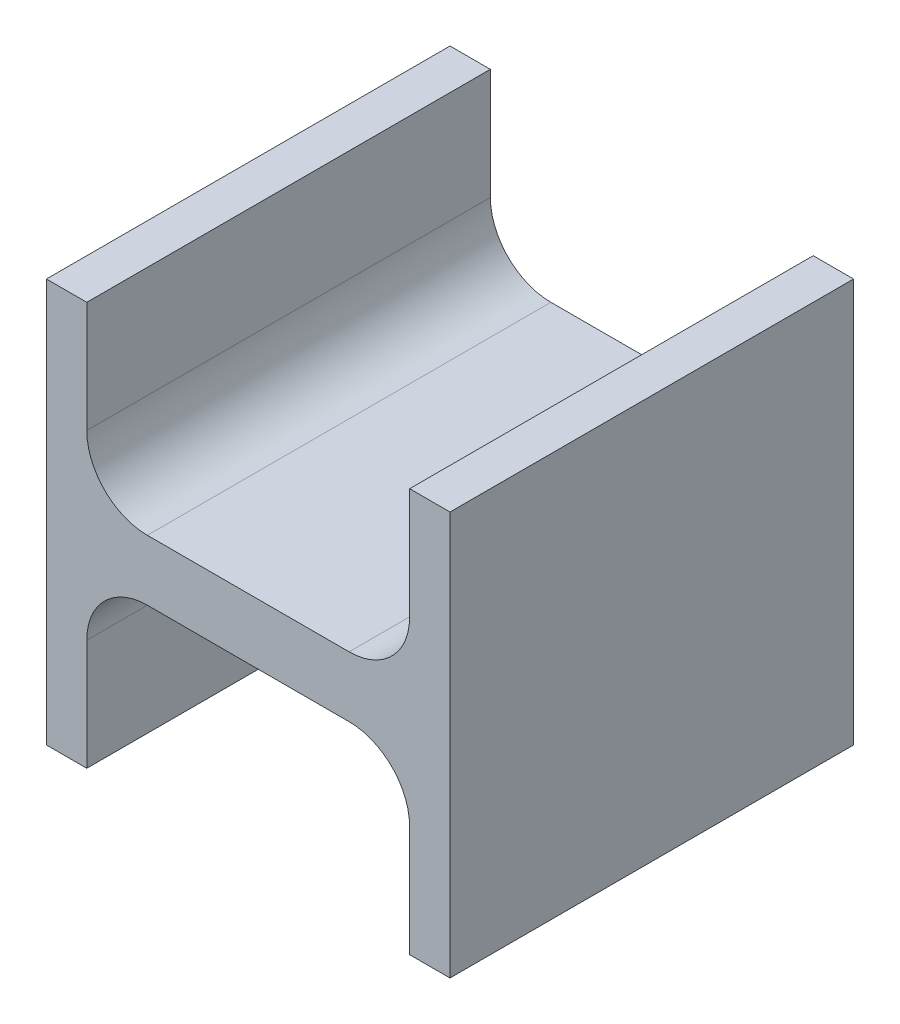
ISO-10303-21;
HEADER;
FILE_DESCRIPTION(('STEP AP214'),'2;1');
FILE_NAME('part.step','',(''),(''),'','','');
FILE_SCHEMA(('AUTOMOTIVE_DESIGN { 1 0 10303 214 1 1 1 1 }'));
ENDSEC;
DATA;
#1=APPLICATION_CONTEXT('core data for automotive mechanical design processes');
#2=APPLICATION_PROTOCOL_DEFINITION('international standard','automotive_design',2000,#1);
#3=PRODUCT_CONTEXT('',#1,'mechanical');
#4=PRODUCT('Part','Part','',(#3));
#5=PRODUCT_RELATED_PRODUCT_CATEGORY('part','',(#4));
#6=PRODUCT_DEFINITION_FORMATION('','',#4);
#7=PRODUCT_DEFINITION_CONTEXT('part definition',#1,'design');
#8=PRODUCT_DEFINITION('design','',#6,#7);
#9=PRODUCT_DEFINITION_SHAPE('','',#8);
#10=(LENGTH_UNIT() NAMED_UNIT(*) SI_UNIT(.MILLI.,.METRE.));
#11=(NAMED_UNIT(*) PLANE_ANGLE_UNIT() SI_UNIT($,.RADIAN.));
#12=(NAMED_UNIT(*) SI_UNIT($,.STERADIAN.) SOLID_ANGLE_UNIT());
#13=UNCERTAINTY_MEASURE_WITH_UNIT(LENGTH_MEASURE(1.E-05),#10,'distance_accuracy_value','');
#14=(GEOMETRIC_REPRESENTATION_CONTEXT(3) GLOBAL_UNCERTAINTY_ASSIGNED_CONTEXT((#13)) GLOBAL_UNIT_ASSIGNED_CONTEXT((#10,
#11,#12)) REPRESENTATION_CONTEXT('',''));
#15=CARTESIAN_POINT('',(0.,0.,0.));
#16=DIRECTION('',(0.,0.,1.));
#17=DIRECTION('',(1.,0.,0.));
#18=AXIS2_PLACEMENT_3D('',#15,#16,#17);
#19=CARTESIAN_POINT('',(-10.,10.,20.));
#20=DIRECTION('',(1.,0.,0.));
#21=DIRECTION('',(0.,1.,0.));
#22=AXIS2_PLACEMENT_3D('',#19,#20,#21);
#23=PLANE('',#22);
#24=DIRECTION('',(0.,-1.,0.));
#25=VECTOR('',#24,1.);
#26=CARTESIAN_POINT('',(-10.,10.,0.));
#27=LINE('',#26,#25);
#28=CARTESIAN_POINT('',(-10.,10.,0.));
#29=VERTEX_POINT('',#28);
#30=CARTESIAN_POINT('',(-10.,-10.,0.));
#31=VERTEX_POINT('',#30);
#32=EDGE_CURVE('E182',#29,#31,#27,.T.);
#33=ORIENTED_EDGE('',*,*,#32,.T.);
#34=DIRECTION('',(0.,0.,-1.));
#35=VECTOR('',#34,1.);
#36=CARTESIAN_POINT('',(-10.,-10.,20.));
#37=LINE('',#36,#35);
#38=CARTESIAN_POINT('',(-10.,-10.,20.));
#39=VERTEX_POINT('',#38);
#40=EDGE_CURVE('E162',#39,#31,#37,.T.);
#41=ORIENTED_EDGE('',*,*,#40,.F.);
#42=DIRECTION('',(0.,-1.,0.));
#43=VECTOR('',#42,1.);
#44=CARTESIAN_POINT('',(-10.,10.,20.));
#45=LINE('',#44,#43);
#46=CARTESIAN_POINT('',(-10.,10.,20.));
#47=VERTEX_POINT('',#46);
#48=EDGE_CURVE('E170',#47,#39,#45,.T.);
#49=ORIENTED_EDGE('',*,*,#48,.F.);
#50=DIRECTION('',(0.,0.,-1.));
#51=VECTOR('',#50,1.);
#52=CARTESIAN_POINT('',(-10.,10.,20.));
#53=LINE('',#52,#51);
#54=EDGE_CURVE('E267',#47,#29,#53,.T.);
#55=ORIENTED_EDGE('',*,*,#54,.T.);
#56=EDGE_LOOP('',(#33,#41,#49,#55));
#57=FACE_BOUND('',#56,.T.);
#58=ADVANCED_FACE('F45',(#57),#23,.F.);
#59=CARTESIAN_POINT('',(-10.,-10.,20.));
#60=DIRECTION('',(0.,1.,0.));
#61=DIRECTION('',(0.,0.,1.));
#62=AXIS2_PLACEMENT_3D('',#59,#60,#61);
#63=PLANE('',#62);
#64=DIRECTION('',(1.,0.,0.));
#65=VECTOR('',#64,1.);
#66=CARTESIAN_POINT('',(-10.,-10.,0.));
#67=LINE('',#66,#65);
#68=CARTESIAN_POINT('',(-8.,-10.,0.));
#69=VERTEX_POINT('',#68);
#70=EDGE_CURVE('E251',#31,#69,#67,.T.);
#71=ORIENTED_EDGE('',*,*,#70,.T.);
#72=DIRECTION('',(0.,0.,-1.));
#73=VECTOR('',#72,1.);
#74=CARTESIAN_POINT('',(-8.,-10.,20.));
#75=LINE('',#74,#73);
#76=CARTESIAN_POINT('',(-8.,-10.,20.));
#77=VERTEX_POINT('',#76);
#78=EDGE_CURVE('E165',#77,#69,#75,.T.);
#79=ORIENTED_EDGE('',*,*,#78,.F.);
#80=DIRECTION('',(1.,0.,0.));
#81=VECTOR('',#80,1.);
#82=CARTESIAN_POINT('',(-10.,-10.,20.));
#83=LINE('',#82,#81);
#84=EDGE_CURVE('E158',#39,#77,#83,.T.);
#85=ORIENTED_EDGE('',*,*,#84,.F.);
#86=ORIENTED_EDGE('',*,*,#40,.T.);
#87=EDGE_LOOP('',(#71,#79,#85,#86));
#88=FACE_BOUND('',#87,.T.);
#89=ADVANCED_FACE('F160',(#88),#63,.F.);
#90=CARTESIAN_POINT('',(-8.,-10.,20.));
#91=DIRECTION('',(-1.,0.,0.));
#92=DIRECTION('',(0.,0.,1.));
#93=AXIS2_PLACEMENT_3D('',#90,#91,#92);
#94=PLANE('',#93);
#95=DIRECTION('',(0.,1.,0.));
#96=VECTOR('',#95,1.);
#97=CARTESIAN_POINT('',(-8.,-10.,0.));
#98=LINE('',#97,#96);
#99=CARTESIAN_POINT('',(-8.,-4.5,0.));
#100=VERTEX_POINT('',#99);
#101=EDGE_CURVE('E246',#69,#100,#98,.T.);
#102=ORIENTED_EDGE('',*,*,#101,.T.);
#103=DIRECTION('',(0.,0.,-1.));
#104=VECTOR('',#103,1.);
#105=CARTESIAN_POINT('',(-8.,-4.5,20.));
#106=LINE('',#105,#104);
#107=CARTESIAN_POINT('',(-8.,-4.5,20.));
#108=VERTEX_POINT('',#107);
#109=EDGE_CURVE('E203',#100,#108,#106,.F.);
#110=ORIENTED_EDGE('',*,*,#109,.T.);
#111=DIRECTION('',(0.,1.,0.));
#112=VECTOR('',#111,1.);
#113=CARTESIAN_POINT('',(-8.,-10.,20.));
#114=LINE('',#113,#112);
#115=EDGE_CURVE('E169',#77,#108,#114,.T.);
#116=ORIENTED_EDGE('',*,*,#115,.F.);
#117=ORIENTED_EDGE('',*,*,#78,.T.);
#118=EDGE_LOOP('',(#102,#110,#116,#117));
#119=FACE_BOUND('',#118,.T.);
#120=ADVANCED_FACE('F310',(#119),#94,.F.);
#121=CARTESIAN_POINT('',(-8.,-1.5,20.));
#122=DIRECTION('',(0.,1.,0.));
#123=DIRECTION('',(0.,0.,1.));
#124=AXIS2_PLACEMENT_3D('',#121,#122,#123);
#125=PLANE('',#124);
#126=DIRECTION('',(1.,0.,0.));
#127=VECTOR('',#126,1.);
#128=CARTESIAN_POINT('',(-8.,-1.5,20.));
#129=LINE('',#128,#127);
#130=CARTESIAN_POINT('',(-5.,-1.5,20.));
#131=VERTEX_POINT('',#130);
#132=CARTESIAN_POINT('',(5.,-1.5,20.));
#133=VERTEX_POINT('',#132);
#134=EDGE_CURVE('E225',#131,#133,#129,.T.);
#135=ORIENTED_EDGE('',*,*,#134,.F.);
#136=DIRECTION('',(0.,0.,-1.));
#137=VECTOR('',#136,1.);
#138=CARTESIAN_POINT('',(-5.,-1.5,0.));
#139=LINE('',#138,#137);
#140=CARTESIAN_POINT('',(-5.,-1.5,0.));
#141=VERTEX_POINT('',#140);
#142=EDGE_CURVE('E200',#131,#141,#139,.T.);
#143=ORIENTED_EDGE('',*,*,#142,.T.);
#144=DIRECTION('',(1.,0.,0.));
#145=VECTOR('',#144,1.);
#146=CARTESIAN_POINT('',(-8.,-1.5,0.));
#147=LINE('',#146,#145);
#148=CARTESIAN_POINT('',(5.,-1.5,0.));
#149=VERTEX_POINT('',#148);
#150=EDGE_CURVE('E240',#141,#149,#147,.T.);
#151=ORIENTED_EDGE('',*,*,#150,.T.);
#152=DIRECTION('',(0.,0.,-1.));
#153=VECTOR('',#152,1.);
#154=CARTESIAN_POINT('',(5.,-1.5,20.));
#155=LINE('',#154,#153);
#156=EDGE_CURVE('E198',#149,#133,#155,.F.);
#157=ORIENTED_EDGE('',*,*,#156,.T.);
#158=EDGE_LOOP('',(#135,#143,#151,#157));
#159=FACE_BOUND('',#158,.T.);
#160=ADVANCED_FACE('F244',(#159),#125,.F.);
#161=CARTESIAN_POINT('',(8.,-1.5,20.));
#162=DIRECTION('',(1.,0.,0.));
#163=DIRECTION('',(0.,0.,-1.));
#164=AXIS2_PLACEMENT_3D('',#161,#162,#163);
#165=PLANE('',#164);
#166=DIRECTION('',(0.,-1.,0.));
#167=VECTOR('',#166,1.);
#168=CARTESIAN_POINT('',(8.,-1.5,20.));
#169=LINE('',#168,#167);
#170=CARTESIAN_POINT('',(8.,-4.5,20.));
#171=VERTEX_POINT('',#170);
#172=CARTESIAN_POINT('',(8.,-10.,20.));
#173=VERTEX_POINT('',#172);
#174=EDGE_CURVE('E222',#171,#173,#169,.T.);
#175=ORIENTED_EDGE('',*,*,#174,.F.);
#176=DIRECTION('',(0.,0.,-1.));
#177=VECTOR('',#176,1.);
#178=CARTESIAN_POINT('',(8.,-4.5,0.));
#179=LINE('',#178,#177);
#180=CARTESIAN_POINT('',(8.,-4.5,0.));
#181=VERTEX_POINT('',#180);
#182=EDGE_CURVE('E205',#171,#181,#179,.T.);
#183=ORIENTED_EDGE('',*,*,#182,.T.);
#184=DIRECTION('',(0.,-1.,0.));
#185=VECTOR('',#184,1.);
#186=CARTESIAN_POINT('',(8.,-1.5,0.));
#187=LINE('',#186,#185);
#188=CARTESIAN_POINT('',(8.,-10.,0.));
#189=VERTEX_POINT('',#188);
#190=EDGE_CURVE('E242',#181,#189,#187,.T.);
#191=ORIENTED_EDGE('',*,*,#190,.T.);
#192=DIRECTION('',(0.,0.,-1.));
#193=VECTOR('',#192,1.);
#194=CARTESIAN_POINT('',(8.,-10.,20.));
#195=LINE('',#194,#193);
#196=EDGE_CURVE('E188',#173,#189,#195,.T.);
#197=ORIENTED_EDGE('',*,*,#196,.F.);
#198=EDGE_LOOP('',(#175,#183,#191,#197));
#199=FACE_BOUND('',#198,.T.);
#200=ADVANCED_FACE('F230',(#199),#165,.F.);
#201=CARTESIAN_POINT('',(8.,-10.,20.));
#202=DIRECTION('',(0.,1.,0.));
#203=DIRECTION('',(0.,0.,1.));
#204=AXIS2_PLACEMENT_3D('',#201,#202,#203);
#205=PLANE('',#204);
#206=DIRECTION('',(1.,0.,0.));
#207=VECTOR('',#206,1.);
#208=CARTESIAN_POINT('',(8.,-10.,0.));
#209=LINE('',#208,#207);
#210=CARTESIAN_POINT('',(10.,-10.,0.));
#211=VERTEX_POINT('',#210);
#212=EDGE_CURVE('E248',#189,#211,#209,.T.);
#213=ORIENTED_EDGE('',*,*,#212,.T.);
#214=DIRECTION('',(0.,0.,-1.));
#215=VECTOR('',#214,1.);
#216=CARTESIAN_POINT('',(10.,-10.,20.));
#217=LINE('',#216,#215);
#218=CARTESIAN_POINT('',(10.,-10.,20.));
#219=VERTEX_POINT('',#218);
#220=EDGE_CURVE('E278',#219,#211,#217,.T.);
#221=ORIENTED_EDGE('',*,*,#220,.F.);
#222=DIRECTION('',(1.,0.,0.));
#223=VECTOR('',#222,1.);
#224=CARTESIAN_POINT('',(8.,-10.,20.));
#225=LINE('',#224,#223);
#226=EDGE_CURVE('E234',#173,#219,#225,.T.);
#227=ORIENTED_EDGE('',*,*,#226,.F.);
#228=ORIENTED_EDGE('',*,*,#196,.T.);
#229=EDGE_LOOP('',(#213,#221,#227,#228));
#230=FACE_BOUND('',#229,.T.);
#231=ADVANCED_FACE('F283',(#230),#205,.F.);
#232=CARTESIAN_POINT('',(10.,10.,20.));
#233=DIRECTION('',(-1.,0.,0.));
#234=DIRECTION('',(0.,-1.,0.));
#235=AXIS2_PLACEMENT_3D('',#232,#233,#234);
#236=PLANE('',#235);
#237=DIRECTION('',(0.,1.,0.));
#238=VECTOR('',#237,1.);
#239=CARTESIAN_POINT('',(10.,10.,0.));
#240=LINE('',#239,#238);
#241=CARTESIAN_POINT('',(10.,10.,0.));
#242=VERTEX_POINT('',#241);
#243=EDGE_CURVE('E256',#211,#242,#240,.T.);
#244=ORIENTED_EDGE('',*,*,#243,.T.);
#245=DIRECTION('',(0.,0.,-1.));
#246=VECTOR('',#245,1.);
#247=CARTESIAN_POINT('',(10.,10.,20.));
#248=LINE('',#247,#246);
#249=CARTESIAN_POINT('',(10.,10.,20.));
#250=VERTEX_POINT('',#249);
#251=EDGE_CURVE('E275',#250,#242,#248,.T.);
#252=ORIENTED_EDGE('',*,*,#251,.F.);
#253=DIRECTION('',(0.,1.,0.));
#254=VECTOR('',#253,1.);
#255=CARTESIAN_POINT('',(10.,10.,20.));
#256=LINE('',#255,#254);
#257=EDGE_CURVE('E297',#219,#250,#256,.T.);
#258=ORIENTED_EDGE('',*,*,#257,.F.);
#259=ORIENTED_EDGE('',*,*,#220,.T.);
#260=EDGE_LOOP('',(#244,#252,#258,#259));
#261=FACE_BOUND('',#260,.T.);
#262=ADVANCED_FACE('F289',(#261),#236,.F.);
#263=CARTESIAN_POINT('',(8.,10.,20.));
#264=DIRECTION('',(0.,-1.,0.));
#265=DIRECTION('',(0.,0.,-1.));
#266=AXIS2_PLACEMENT_3D('',#263,#264,#265);
#267=PLANE('',#266);
#268=DIRECTION('',(-1.,0.,0.));
#269=VECTOR('',#268,1.);
#270=CARTESIAN_POINT('',(8.,10.,0.));
#271=LINE('',#270,#269);
#272=CARTESIAN_POINT('',(8.,10.,0.));
#273=VERTEX_POINT('',#272);
#274=EDGE_CURVE('E258',#242,#273,#271,.T.);
#275=ORIENTED_EDGE('',*,*,#274,.T.);
#276=DIRECTION('',(0.,0.,-1.));
#277=VECTOR('',#276,1.);
#278=CARTESIAN_POINT('',(8.,10.,20.));
#279=LINE('',#278,#277);
#280=CARTESIAN_POINT('',(8.,10.,20.));
#281=VERTEX_POINT('',#280);
#282=EDGE_CURVE('E272',#281,#273,#279,.T.);
#283=ORIENTED_EDGE('',*,*,#282,.F.);
#284=DIRECTION('',(-1.,0.,0.));
#285=VECTOR('',#284,1.);
#286=CARTESIAN_POINT('',(8.,10.,20.));
#287=LINE('',#286,#285);
#288=EDGE_CURVE('E295',#250,#281,#287,.T.);
#289=ORIENTED_EDGE('',*,*,#288,.F.);
#290=ORIENTED_EDGE('',*,*,#251,.T.);
#291=EDGE_LOOP('',(#275,#283,#289,#290));
#292=FACE_BOUND('',#291,.T.);
#293=ADVANCED_FACE('F293',(#292),#267,.F.);
#294=CARTESIAN_POINT('',(8.,1.5,20.));
#295=DIRECTION('',(1.,0.,0.));
#296=DIRECTION('',(0.,0.,-1.));
#297=AXIS2_PLACEMENT_3D('',#294,#295,#296);
#298=PLANE('',#297);
#299=DIRECTION('',(0.,-1.,0.));
#300=VECTOR('',#299,1.);
#301=CARTESIAN_POINT('',(8.,1.5,0.));
#302=LINE('',#301,#300);
#303=CARTESIAN_POINT('',(8.,4.5,0.));
#304=VERTEX_POINT('',#303);
#305=EDGE_CURVE('E260',#273,#304,#302,.T.);
#306=ORIENTED_EDGE('',*,*,#305,.T.);
#307=DIRECTION('',(0.,0.,-1.));
#308=VECTOR('',#307,1.);
#309=CARTESIAN_POINT('',(8.,4.5,20.));
#310=LINE('',#309,#308);
#311=CARTESIAN_POINT('',(8.,4.5,20.));
#312=VERTEX_POINT('',#311);
#313=EDGE_CURVE('E60',#304,#312,#310,.F.);
#314=ORIENTED_EDGE('',*,*,#313,.T.);
#315=DIRECTION('',(0.,-1.,0.));
#316=VECTOR('',#315,1.);
#317=CARTESIAN_POINT('',(8.,1.5,20.));
#318=LINE('',#317,#316);
#319=EDGE_CURVE('E296',#281,#312,#318,.T.);
#320=ORIENTED_EDGE('',*,*,#319,.F.);
#321=ORIENTED_EDGE('',*,*,#282,.T.);
#322=EDGE_LOOP('',(#306,#314,#320,#321));
#323=FACE_BOUND('',#322,.T.);
#324=ADVANCED_FACE('F345',(#323),#298,.F.);
#325=CARTESIAN_POINT('',(-8.,1.5,20.));
#326=DIRECTION('',(0.,-1.,0.));
#327=DIRECTION('',(0.,0.,-1.));
#328=AXIS2_PLACEMENT_3D('',#325,#326,#327);
#329=PLANE('',#328);
#330=DIRECTION('',(-1.,0.,0.));
#331=VECTOR('',#330,1.);
#332=CARTESIAN_POINT('',(-8.,1.5,20.));
#333=LINE('',#332,#331);
#334=CARTESIAN_POINT('',(5.,1.5,20.));
#335=VERTEX_POINT('',#334);
#336=CARTESIAN_POINT('',(-5.,1.5,20.));
#337=VERTEX_POINT('',#336);
#338=EDGE_CURVE('E299',#335,#337,#333,.T.);
#339=ORIENTED_EDGE('',*,*,#338,.F.);
#340=DIRECTION('',(0.,0.,-1.));
#341=VECTOR('',#340,1.);
#342=CARTESIAN_POINT('',(5.,1.5,0.));
#343=LINE('',#342,#341);
#344=CARTESIAN_POINT('',(5.,1.5,0.));
#345=VERTEX_POINT('',#344);
#346=EDGE_CURVE('E208',#335,#345,#343,.T.);
#347=ORIENTED_EDGE('',*,*,#346,.T.);
#348=DIRECTION('',(-1.,0.,0.));
#349=VECTOR('',#348,1.);
#350=CARTESIAN_POINT('',(-8.,1.5,0.));
#351=LINE('',#350,#349);
#352=CARTESIAN_POINT('',(-5.,1.5,0.));
#353=VERTEX_POINT('',#352);
#354=EDGE_CURVE('E262',#345,#353,#351,.T.);
#355=ORIENTED_EDGE('',*,*,#354,.T.);
#356=DIRECTION('',(0.,0.,-1.));
#357=VECTOR('',#356,1.);
#358=CARTESIAN_POINT('',(-5.,1.5,20.));
#359=LINE('',#358,#357);
#360=EDGE_CURVE('E186',#353,#337,#359,.F.);
#361=ORIENTED_EDGE('',*,*,#360,.T.);
#362=EDGE_LOOP('',(#339,#347,#355,#361));
#363=FACE_BOUND('',#362,.T.);
#364=ADVANCED_FACE('F348',(#363),#329,.F.);
#365=CARTESIAN_POINT('',(-8.,10.,20.));
#366=DIRECTION('',(-1.,0.,0.));
#367=DIRECTION('',(0.,0.,1.));
#368=AXIS2_PLACEMENT_3D('',#365,#366,#367);
#369=PLANE('',#368);
#370=DIRECTION('',(0.,1.,0.));
#371=VECTOR('',#370,1.);
#372=CARTESIAN_POINT('',(-8.,10.,20.));
#373=LINE('',#372,#371);
#374=CARTESIAN_POINT('',(-8.,4.5,20.));
#375=VERTEX_POINT('',#374);
#376=CARTESIAN_POINT('',(-8.,10.,20.));
#377=VERTEX_POINT('',#376);
#378=EDGE_CURVE('E305',#375,#377,#373,.T.);
#379=ORIENTED_EDGE('',*,*,#378,.F.);
#380=DIRECTION('',(0.,0.,-1.));
#381=VECTOR('',#380,1.);
#382=CARTESIAN_POINT('',(-8.,4.5,0.));
#383=LINE('',#382,#381);
#384=CARTESIAN_POINT('',(-8.,4.5,0.));
#385=VERTEX_POINT('',#384);
#386=EDGE_CURVE('E183',#375,#385,#383,.T.);
#387=ORIENTED_EDGE('',*,*,#386,.T.);
#388=DIRECTION('',(0.,1.,0.));
#389=VECTOR('',#388,1.);
#390=CARTESIAN_POINT('',(-8.,10.,0.));
#391=LINE('',#390,#389);
#392=CARTESIAN_POINT('',(-8.,10.,0.));
#393=VERTEX_POINT('',#392);
#394=EDGE_CURVE('E264',#385,#393,#391,.T.);
#395=ORIENTED_EDGE('',*,*,#394,.T.);
#396=DIRECTION('',(0.,0.,-1.));
#397=VECTOR('',#396,1.);
#398=CARTESIAN_POINT('',(-8.,10.,20.));
#399=LINE('',#398,#397);
#400=EDGE_CURVE('E269',#377,#393,#399,.T.);
#401=ORIENTED_EDGE('',*,*,#400,.F.);
#402=EDGE_LOOP('',(#379,#387,#395,#401));
#403=FACE_BOUND('',#402,.T.);
#404=ADVANCED_FACE('F351',(#403),#369,.F.);
#405=CARTESIAN_POINT('',(-10.,10.,20.));
#406=DIRECTION('',(0.,-1.,0.));
#407=DIRECTION('',(0.,0.,-1.));
#408=AXIS2_PLACEMENT_3D('',#405,#406,#407);
#409=PLANE('',#408);
#410=DIRECTION('',(-1.,0.,0.));
#411=VECTOR('',#410,1.);
#412=CARTESIAN_POINT('',(-10.,10.,0.));
#413=LINE('',#412,#411);
#414=EDGE_CURVE('E179',#393,#29,#413,.T.);
#415=ORIENTED_EDGE('',*,*,#414,.T.);
#416=ORIENTED_EDGE('',*,*,#54,.F.);
#417=DIRECTION('',(-1.,0.,0.));
#418=VECTOR('',#417,1.);
#419=CARTESIAN_POINT('',(-10.,10.,20.));
#420=LINE('',#419,#418);
#421=EDGE_CURVE('E175',#377,#47,#420,.T.);
#422=ORIENTED_EDGE('',*,*,#421,.F.);
#423=ORIENTED_EDGE('',*,*,#400,.T.);
#424=EDGE_LOOP('',(#415,#416,#422,#423));
#425=FACE_BOUND('',#424,.T.);
#426=ADVANCED_FACE('F355',(#425),#409,.F.);
#427=CARTESIAN_POINT('',(0.,0.,20.));
#428=DIRECTION('',(0.,0.,1.));
#429=DIRECTION('',(1.,0.,0.));
#430=AXIS2_PLACEMENT_3D('',#427,#428,#429);
#431=PLANE('',#430);
#432=ORIENTED_EDGE('',*,*,#48,.T.);
#433=ORIENTED_EDGE('',*,*,#84,.T.);
#434=ORIENTED_EDGE('',*,*,#115,.T.);
#435=CARTESIAN_POINT('',(-5.,-4.5,20.));
#436=DIRECTION('',(0.,0.,1.));
#437=DIRECTION('',(1.,0.,0.));
#438=AXIS2_PLACEMENT_3D('',#435,#436,#437);
#439=CIRCLE('',#438,3.);
#440=EDGE_CURVE('E214',#108,#131,#439,.F.);
#441=ORIENTED_EDGE('',*,*,#440,.T.);
#442=ORIENTED_EDGE('',*,*,#134,.T.);
#443=CARTESIAN_POINT('',(5.,-4.5,20.));
#444=DIRECTION('',(0.,0.,1.));
#445=DIRECTION('',(1.,0.,0.));
#446=AXIS2_PLACEMENT_3D('',#443,#444,#445);
#447=CIRCLE('',#446,3.);
#448=EDGE_CURVE('E218',#133,#171,#447,.F.);
#449=ORIENTED_EDGE('',*,*,#448,.T.);
#450=ORIENTED_EDGE('',*,*,#174,.T.);
#451=ORIENTED_EDGE('',*,*,#226,.T.);
#452=ORIENTED_EDGE('',*,*,#257,.T.);
#453=ORIENTED_EDGE('',*,*,#288,.T.);
#454=ORIENTED_EDGE('',*,*,#319,.T.);
#455=CARTESIAN_POINT('',(5.,4.5,20.));
#456=DIRECTION('',(0.,0.,1.));
#457=DIRECTION('',(1.,0.,0.));
#458=AXIS2_PLACEMENT_3D('',#455,#456,#457);
#459=CIRCLE('',#458,3.);
#460=EDGE_CURVE('E12',#312,#335,#459,.F.);
#461=ORIENTED_EDGE('',*,*,#460,.T.);
#462=ORIENTED_EDGE('',*,*,#338,.T.);
#463=CARTESIAN_POINT('',(-5.,4.5,20.));
#464=DIRECTION('',(0.,0.,1.));
#465=DIRECTION('',(1.,0.,0.));
#466=AXIS2_PLACEMENT_3D('',#463,#464,#465);
#467=CIRCLE('',#466,3.);
#468=EDGE_CURVE('E196',#337,#375,#467,.F.);
#469=ORIENTED_EDGE('',*,*,#468,.T.);
#470=ORIENTED_EDGE('',*,*,#378,.T.);
#471=ORIENTED_EDGE('',*,*,#421,.T.);
#472=EDGE_LOOP('',(#432,#433,#434,#441,#442,#449,#450,#451,#452,#453,#454,#461,#462,#469,#470,#471));
#473=FACE_BOUND('',#472,.T.);
#474=ADVANCED_FACE('F173',(#473),#431,.T.);
#475=CARTESIAN_POINT('',(0.,0.,0.));
#476=DIRECTION('',(0.,0.,1.));
#477=DIRECTION('',(1.,0.,0.));
#478=AXIS2_PLACEMENT_3D('',#475,#476,#477);
#479=PLANE('',#478);
#480=ORIENTED_EDGE('',*,*,#32,.F.);
#481=ORIENTED_EDGE('',*,*,#414,.F.);
#482=ORIENTED_EDGE('',*,*,#394,.F.);
#483=CARTESIAN_POINT('',(-5.,4.5,0.));
#484=DIRECTION('',(0.,0.,1.));
#485=DIRECTION('',(1.,0.,0.));
#486=AXIS2_PLACEMENT_3D('',#483,#484,#485);
#487=CIRCLE('',#486,3.);
#488=EDGE_CURVE('E193',#385,#353,#487,.T.);
#489=ORIENTED_EDGE('',*,*,#488,.T.);
#490=ORIENTED_EDGE('',*,*,#354,.F.);
#491=CARTESIAN_POINT('',(5.,4.5,0.));
#492=DIRECTION('',(0.,0.,1.));
#493=DIRECTION('',(1.,0.,0.));
#494=AXIS2_PLACEMENT_3D('',#491,#492,#493);
#495=CIRCLE('',#494,3.);
#496=EDGE_CURVE('E53',#345,#304,#495,.T.);
#497=ORIENTED_EDGE('',*,*,#496,.T.);
#498=ORIENTED_EDGE('',*,*,#305,.F.);
#499=ORIENTED_EDGE('',*,*,#274,.F.);
#500=ORIENTED_EDGE('',*,*,#243,.F.);
#501=ORIENTED_EDGE('',*,*,#212,.F.);
#502=ORIENTED_EDGE('',*,*,#190,.F.);
#503=CARTESIAN_POINT('',(5.,-4.5,0.));
#504=DIRECTION('',(0.,0.,1.));
#505=DIRECTION('',(1.,0.,0.));
#506=AXIS2_PLACEMENT_3D('',#503,#504,#505);
#507=CIRCLE('',#506,3.);
#508=EDGE_CURVE('E216',#181,#149,#507,.T.);
#509=ORIENTED_EDGE('',*,*,#508,.T.);
#510=ORIENTED_EDGE('',*,*,#150,.F.);
#511=CARTESIAN_POINT('',(-5.,-4.5,0.));
#512=DIRECTION('',(0.,0.,1.));
#513=DIRECTION('',(1.,0.,0.));
#514=AXIS2_PLACEMENT_3D('',#511,#512,#513);
#515=CIRCLE('',#514,3.);
#516=EDGE_CURVE('E212',#141,#100,#515,.T.);
#517=ORIENTED_EDGE('',*,*,#516,.T.);
#518=ORIENTED_EDGE('',*,*,#101,.F.);
#519=ORIENTED_EDGE('',*,*,#70,.F.);
#520=EDGE_LOOP('',(#480,#481,#482,#489,#490,#497,#498,#499,#500,#501,#502,#509,#510,#517,#518,#519));
#521=FACE_BOUND('',#520,.T.);
#522=ADVANCED_FACE('F239',(#521),#479,.F.);
#523=CARTESIAN_POINT('',(-5.,4.5,20.));
#524=DIRECTION('',(0.,0.,1.));
#525=DIRECTION('',(1.,0.,0.));
#526=AXIS2_PLACEMENT_3D('',#523,#524,#525);
#527=CYLINDRICAL_SURFACE('',#526,3.);
#528=ORIENTED_EDGE('',*,*,#468,.F.);
#529=ORIENTED_EDGE('',*,*,#360,.F.);
#530=ORIENTED_EDGE('',*,*,#488,.F.);
#531=ORIENTED_EDGE('',*,*,#386,.F.);
#532=EDGE_LOOP('',(#528,#529,#530,#531));
#533=FACE_BOUND('',#532,.T.);
#534=ADVANCED_FACE('F318',(#533),#527,.F.);
#535=CARTESIAN_POINT('',(-5.,-4.5,20.));
#536=DIRECTION('',(0.,0.,1.));
#537=DIRECTION('',(1.,0.,0.));
#538=AXIS2_PLACEMENT_3D('',#535,#536,#537);
#539=CYLINDRICAL_SURFACE('',#538,3.);
#540=ORIENTED_EDGE('',*,*,#440,.F.);
#541=ORIENTED_EDGE('',*,*,#109,.F.);
#542=ORIENTED_EDGE('',*,*,#516,.F.);
#543=ORIENTED_EDGE('',*,*,#142,.F.);
#544=EDGE_LOOP('',(#540,#541,#542,#543));
#545=FACE_BOUND('',#544,.T.);
#546=ADVANCED_FACE('F314',(#545),#539,.F.);
#547=CARTESIAN_POINT('',(5.,-4.5,20.));
#548=DIRECTION('',(0.,0.,1.));
#549=DIRECTION('',(1.,0.,0.));
#550=AXIS2_PLACEMENT_3D('',#547,#548,#549);
#551=CYLINDRICAL_SURFACE('',#550,3.);
#552=ORIENTED_EDGE('',*,*,#448,.F.);
#553=ORIENTED_EDGE('',*,*,#156,.F.);
#554=ORIENTED_EDGE('',*,*,#508,.F.);
#555=ORIENTED_EDGE('',*,*,#182,.F.);
#556=EDGE_LOOP('',(#552,#553,#554,#555));
#557=FACE_BOUND('',#556,.T.);
#558=ADVANCED_FACE('F236',(#557),#551,.F.);
#559=CARTESIAN_POINT('',(5.,4.5,20.));
#560=DIRECTION('',(0.,0.,1.));
#561=DIRECTION('',(1.,0.,0.));
#562=AXIS2_PLACEMENT_3D('',#559,#560,#561);
#563=CYLINDRICAL_SURFACE('',#562,3.);
#564=ORIENTED_EDGE('',*,*,#460,.F.);
#565=ORIENTED_EDGE('',*,*,#313,.F.);
#566=ORIENTED_EDGE('',*,*,#496,.F.);
#567=ORIENTED_EDGE('',*,*,#346,.F.);
#568=EDGE_LOOP('',(#564,#565,#566,#567));
#569=FACE_BOUND('',#568,.T.);
#570=ADVANCED_FACE('F47',(#569),#563,.F.);
#571=CLOSED_SHELL('',(#58,#89,#120,#160,#200,#231,#262,#293,#324,#364,#404,#426,#474,#522,#534,
#546,#558,#570));
#572=MANIFOLD_SOLID_BREP('B2',#571);
#573=ADVANCED_BREP_SHAPE_REPRESENTATION('',(#18,#572),#14);
#574=SHAPE_DEFINITION_REPRESENTATION(#9,#573);
ENDSEC;
END-ISO-10303-21;
